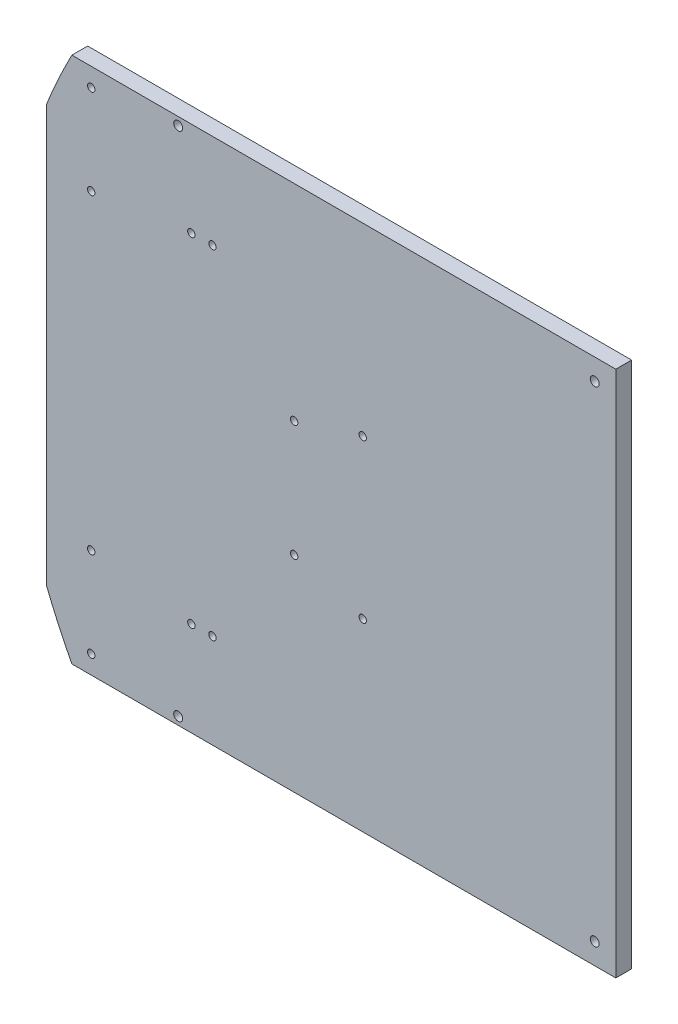
ISO-10303-21;
HEADER;
FILE_DESCRIPTION(('STEP AP214'),'2;1');
FILE_NAME('part.step','',(''),(''),'','','');
FILE_SCHEMA(('AUTOMOTIVE_DESIGN { 1 0 10303 214 1 1 1 1 }'));
ENDSEC;
DATA;
#1=APPLICATION_CONTEXT('core data for automotive mechanical design processes');
#2=APPLICATION_PROTOCOL_DEFINITION('international standard','automotive_design',2000,#1);
#3=PRODUCT_CONTEXT('',#1,'mechanical');
#4=PRODUCT('Part','Part','',(#3));
#5=PRODUCT_RELATED_PRODUCT_CATEGORY('part','',(#4));
#6=PRODUCT_DEFINITION_FORMATION('','',#4);
#7=PRODUCT_DEFINITION_CONTEXT('part definition',#1,'design');
#8=PRODUCT_DEFINITION('design','',#6,#7);
#9=PRODUCT_DEFINITION_SHAPE('','',#8);
#10=(LENGTH_UNIT() NAMED_UNIT(*) SI_UNIT(.MILLI.,.METRE.));
#11=(NAMED_UNIT(*) PLANE_ANGLE_UNIT() SI_UNIT($,.RADIAN.));
#12=(NAMED_UNIT(*) SI_UNIT($,.STERADIAN.) SOLID_ANGLE_UNIT());
#13=UNCERTAINTY_MEASURE_WITH_UNIT(LENGTH_MEASURE(1.E-05),#10,'distance_accuracy_value','');
#14=(GEOMETRIC_REPRESENTATION_CONTEXT(3) GLOBAL_UNCERTAINTY_ASSIGNED_CONTEXT((#13)) GLOBAL_UNIT_ASSIGNED_CONTEXT((#10,
#11,#12)) REPRESENTATION_CONTEXT('',''));
#15=CARTESIAN_POINT('',(0.,0.,0.));
#16=DIRECTION('',(0.,0.,1.));
#17=DIRECTION('',(1.,0.,0.));
#18=AXIS2_PLACEMENT_3D('',#15,#16,#17);
#19=CARTESIAN_POINT('',(8.,92.,239.3));
#20=DIRECTION('',(0.,0.,1.));
#21=DIRECTION('',(1.,0.,0.));
#22=AXIS2_PLACEMENT_3D('',#19,#20,#21);
#23=CYLINDRICAL_SURFACE('',#22,1.7);
#24=DIRECTION('',(0.,0.,1.));
#25=VECTOR('',#24,1.);
#26=CARTESIAN_POINT('',(9.7,92.,239.3));
#27=LINE('',#26,#25);
#28=CARTESIAN_POINT('',(9.7,92.,239.5));
#29=VERTEX_POINT('',#28);
#30=CARTESIAN_POINT('',(9.7,92.,245.5));
#31=VERTEX_POINT('',#30);
#32=EDGE_CURVE('E9',#29,#31,#27,.T.);
#33=ORIENTED_EDGE('',*,*,#32,.F.);
#34=CARTESIAN_POINT('',(8.,92.,239.5));
#35=DIRECTION('',(0.,0.,1.));
#36=DIRECTION('',(1.,0.,0.));
#37=AXIS2_PLACEMENT_3D('',#34,#35,#36);
#38=CIRCLE('',#37,1.7);
#39=EDGE_CURVE('E409',#29,#29,#38,.T.);
#40=ORIENTED_EDGE('',*,*,#39,.F.);
#41=ORIENTED_EDGE('',*,*,#32,.T.);
#42=CARTESIAN_POINT('',(8.,92.,245.5));
#43=DIRECTION('',(0.,0.,1.));
#44=DIRECTION('',(1.,0.,0.));
#45=AXIS2_PLACEMENT_3D('',#42,#43,#44);
#46=CIRCLE('',#45,1.7);
#47=EDGE_CURVE('E456',#31,#31,#46,.T.);
#48=ORIENTED_EDGE('',*,*,#47,.T.);
#49=EDGE_LOOP('',(#33,#40,#41,#48));
#50=FACE_BOUND('',#49,.T.);
#51=ADVANCED_FACE('F14',(#50),#23,.F.);
#52=CARTESIAN_POINT('',(-80.,30.,239.4));
#53=DIRECTION('',(0.,0.,1.));
#54=DIRECTION('',(1.,0.,0.));
#55=AXIS2_PLACEMENT_3D('',#52,#53,#54);
#56=CYLINDRICAL_SURFACE('',#55,1.4);
#57=DIRECTION('',(0.,0.,1.));
#58=VECTOR('',#57,1.);
#59=CARTESIAN_POINT('',(-78.6,30.,239.4));
#60=LINE('',#59,#58);
#61=CARTESIAN_POINT('',(-78.6,30.,239.5));
#62=VERTEX_POINT('',#61);
#63=CARTESIAN_POINT('',(-78.6,30.,245.5));
#64=VERTEX_POINT('',#63);
#65=EDGE_CURVE('E25',#62,#64,#60,.T.);
#66=ORIENTED_EDGE('',*,*,#65,.F.);
#67=CARTESIAN_POINT('',(-80.,30.,239.5));
#68=DIRECTION('',(0.,0.,1.));
#69=DIRECTION('',(1.,0.,0.));
#70=AXIS2_PLACEMENT_3D('',#67,#68,#69);
#71=CIRCLE('',#70,1.4);
#72=EDGE_CURVE('E405',#62,#62,#71,.T.);
#73=ORIENTED_EDGE('',*,*,#72,.F.);
#74=ORIENTED_EDGE('',*,*,#65,.T.);
#75=CARTESIAN_POINT('',(-80.,30.,245.5));
#76=DIRECTION('',(0.,0.,1.));
#77=DIRECTION('',(1.,0.,0.));
#78=AXIS2_PLACEMENT_3D('',#75,#76,#77);
#79=CIRCLE('',#78,1.4);
#80=EDGE_CURVE('E311',#64,#64,#79,.T.);
#81=ORIENTED_EDGE('',*,*,#80,.T.);
#82=EDGE_LOOP('',(#66,#73,#74,#81));
#83=FACE_BOUND('',#82,.T.);
#84=ADVANCED_FACE('F696',(#83),#56,.F.);
#85=CARTESIAN_POINT('',(-150.,97.,239.3));
#86=DIRECTION('',(0.,0.,1.));
#87=DIRECTION('',(1.,0.,0.));
#88=AXIS2_PLACEMENT_3D('',#85,#86,#87);
#89=CYLINDRICAL_SURFACE('',#88,1.7);
#90=DIRECTION('',(0.,0.,1.));
#91=VECTOR('',#90,1.);
#92=CARTESIAN_POINT('',(-148.3,97.,239.3));
#93=LINE('',#92,#91);
#94=CARTESIAN_POINT('',(-148.3,97.,239.5));
#95=VERTEX_POINT('',#94);
#96=CARTESIAN_POINT('',(-148.3,97.,245.5));
#97=VERTEX_POINT('',#96);
#98=EDGE_CURVE('E445',#95,#97,#93,.T.);
#99=ORIENTED_EDGE('',*,*,#98,.F.);
#100=CARTESIAN_POINT('',(-150.,97.,239.5));
#101=DIRECTION('',(0.,0.,1.));
#102=DIRECTION('',(1.,0.,0.));
#103=AXIS2_PLACEMENT_3D('',#100,#101,#102);
#104=CIRCLE('',#103,1.7);
#105=EDGE_CURVE('E410',#95,#95,#104,.T.);
#106=ORIENTED_EDGE('',*,*,#105,.F.);
#107=ORIENTED_EDGE('',*,*,#98,.T.);
#108=CARTESIAN_POINT('',(-150.,97.,245.5));
#109=DIRECTION('',(0.,0.,1.));
#110=DIRECTION('',(1.,0.,0.));
#111=AXIS2_PLACEMENT_3D('',#108,#109,#110);
#112=CIRCLE('',#111,1.7);
#113=EDGE_CURVE('E307',#97,#97,#112,.T.);
#114=ORIENTED_EDGE('',*,*,#113,.T.);
#115=EDGE_LOOP('',(#99,#106,#107,#114));
#116=FACE_BOUND('',#115,.T.);
#117=ADVANCED_FACE('F701',(#116),#89,.F.);
#118=CARTESIAN_POINT('',(-183.,93.,239.4));
#119=DIRECTION('',(0.,0.,1.));
#120=DIRECTION('',(1.,0.,0.));
#121=AXIS2_PLACEMENT_3D('',#118,#119,#120);
#122=CYLINDRICAL_SURFACE('',#121,1.4);
#123=DIRECTION('',(0.,0.,1.));
#124=VECTOR('',#123,1.);
#125=CARTESIAN_POINT('',(-181.6,93.,239.4));
#126=LINE('',#125,#124);
#127=CARTESIAN_POINT('',(-181.6,93.,239.5));
#128=VERTEX_POINT('',#127);
#129=CARTESIAN_POINT('',(-181.6,93.,245.5));
#130=VERTEX_POINT('',#129);
#131=EDGE_CURVE('E442',#128,#130,#126,.T.);
#132=ORIENTED_EDGE('',*,*,#131,.F.);
#133=CARTESIAN_POINT('',(-183.,93.,239.5));
#134=DIRECTION('',(0.,0.,1.));
#135=DIRECTION('',(1.,0.,0.));
#136=AXIS2_PLACEMENT_3D('',#133,#134,#135);
#137=CIRCLE('',#136,1.4);
#138=EDGE_CURVE('E414',#128,#128,#137,.T.);
#139=ORIENTED_EDGE('',*,*,#138,.F.);
#140=ORIENTED_EDGE('',*,*,#131,.T.);
#141=CARTESIAN_POINT('',(-183.,93.,245.5));
#142=DIRECTION('',(0.,0.,1.));
#143=DIRECTION('',(1.,0.,0.));
#144=AXIS2_PLACEMENT_3D('',#141,#142,#143);
#145=CIRCLE('',#144,1.4);
#146=EDGE_CURVE('E283',#130,#130,#145,.T.);
#147=ORIENTED_EDGE('',*,*,#146,.T.);
#148=EDGE_LOOP('',(#132,#139,#140,#147));
#149=FACE_BOUND('',#148,.T.);
#150=ADVANCED_FACE('F830',(#149),#122,.F.);
#151=CARTESIAN_POINT('',(-137.,64.2,239.4));
#152=DIRECTION('',(0.,0.,1.));
#153=DIRECTION('',(1.,0.,0.));
#154=AXIS2_PLACEMENT_3D('',#151,#152,#153);
#155=CYLINDRICAL_SURFACE('',#154,1.4);
#156=DIRECTION('',(0.,0.,1.));
#157=VECTOR('',#156,1.);
#158=CARTESIAN_POINT('',(-135.6,64.2,239.4));
#159=LINE('',#158,#157);
#160=CARTESIAN_POINT('',(-135.6,64.2,239.5));
#161=VERTEX_POINT('',#160);
#162=CARTESIAN_POINT('',(-135.6,64.2,245.5));
#163=VERTEX_POINT('',#162);
#164=EDGE_CURVE('E390',#161,#163,#159,.T.);
#165=ORIENTED_EDGE('',*,*,#164,.F.);
#166=CARTESIAN_POINT('',(-137.,64.2,239.5));
#167=DIRECTION('',(0.,0.,1.));
#168=DIRECTION('',(1.,0.,0.));
#169=AXIS2_PLACEMENT_3D('',#166,#167,#168);
#170=CIRCLE('',#169,1.4);
#171=EDGE_CURVE('E432',#161,#161,#170,.T.);
#172=ORIENTED_EDGE('',*,*,#171,.F.);
#173=ORIENTED_EDGE('',*,*,#164,.T.);
#174=CARTESIAN_POINT('',(-137.,64.2,245.5));
#175=DIRECTION('',(0.,0.,1.));
#176=DIRECTION('',(1.,0.,0.));
#177=AXIS2_PLACEMENT_3D('',#174,#175,#176);
#178=CIRCLE('',#177,1.4);
#179=EDGE_CURVE('E279',#163,#163,#178,.T.);
#180=ORIENTED_EDGE('',*,*,#179,.T.);
#181=EDGE_LOOP('',(#165,#172,#173,#180));
#182=FACE_BOUND('',#181,.T.);
#183=ADVANCED_FACE('F714',(#182),#155,.F.);
#184=CARTESIAN_POINT('',(-145.,64.2,239.4));
#185=DIRECTION('',(0.,0.,1.));
#186=DIRECTION('',(1.,0.,0.));
#187=AXIS2_PLACEMENT_3D('',#184,#185,#186);
#188=CYLINDRICAL_SURFACE('',#187,1.4);
#189=DIRECTION('',(0.,0.,1.));
#190=VECTOR('',#189,1.);
#191=CARTESIAN_POINT('',(-143.6,64.2,239.4));
#192=LINE('',#191,#190);
#193=CARTESIAN_POINT('',(-143.6,64.2,239.5));
#194=VERTEX_POINT('',#193);
#195=CARTESIAN_POINT('',(-143.6,64.2,245.5));
#196=VERTEX_POINT('',#195);
#197=EDGE_CURVE('E387',#194,#196,#192,.T.);
#198=ORIENTED_EDGE('',*,*,#197,.F.);
#199=CARTESIAN_POINT('',(-145.,64.2,239.5));
#200=DIRECTION('',(0.,0.,1.));
#201=DIRECTION('',(1.,0.,0.));
#202=AXIS2_PLACEMENT_3D('',#199,#200,#201);
#203=CIRCLE('',#202,1.4);
#204=EDGE_CURVE('E452',#194,#194,#203,.T.);
#205=ORIENTED_EDGE('',*,*,#204,.F.);
#206=ORIENTED_EDGE('',*,*,#197,.T.);
#207=CARTESIAN_POINT('',(-145.,64.2,245.5));
#208=DIRECTION('',(0.,0.,1.));
#209=DIRECTION('',(1.,0.,0.));
#210=AXIS2_PLACEMENT_3D('',#207,#208,#209);
#211=CIRCLE('',#210,1.4);
#212=EDGE_CURVE('E284',#196,#196,#211,.T.);
#213=ORIENTED_EDGE('',*,*,#212,.T.);
#214=EDGE_LOOP('',(#198,#205,#206,#213));
#215=FACE_BOUND('',#214,.T.);
#216=ADVANCED_FACE('F506',(#215),#188,.F.);
#217=CARTESIAN_POINT('',(-183.,59.,239.4));
#218=DIRECTION('',(0.,0.,1.));
#219=DIRECTION('',(1.,0.,0.));
#220=AXIS2_PLACEMENT_3D('',#217,#218,#219);
#221=CYLINDRICAL_SURFACE('',#220,1.4);
#222=DIRECTION('',(0.,0.,1.));
#223=VECTOR('',#222,1.);
#224=CARTESIAN_POINT('',(-181.6,59.,239.4));
#225=LINE('',#224,#223);
#226=CARTESIAN_POINT('',(-181.6,59.,239.5));
#227=VERTEX_POINT('',#226);
#228=CARTESIAN_POINT('',(-181.6,59.,245.5));
#229=VERTEX_POINT('',#228);
#230=EDGE_CURVE('E391',#227,#229,#225,.T.);
#231=ORIENTED_EDGE('',*,*,#230,.F.);
#232=CARTESIAN_POINT('',(-183.,59.,239.5));
#233=DIRECTION('',(0.,0.,1.));
#234=DIRECTION('',(1.,0.,0.));
#235=AXIS2_PLACEMENT_3D('',#232,#233,#234);
#236=CIRCLE('',#235,1.4);
#237=EDGE_CURVE('E295',#227,#227,#236,.T.);
#238=ORIENTED_EDGE('',*,*,#237,.F.);
#239=ORIENTED_EDGE('',*,*,#230,.T.);
#240=CARTESIAN_POINT('',(-183.,59.,245.5));
#241=DIRECTION('',(0.,0.,1.));
#242=DIRECTION('',(1.,0.,0.));
#243=AXIS2_PLACEMENT_3D('',#240,#241,#242);
#244=CIRCLE('',#243,1.4);
#245=EDGE_CURVE('E437',#229,#229,#244,.T.);
#246=ORIENTED_EDGE('',*,*,#245,.T.);
#247=EDGE_LOOP('',(#231,#238,#239,#246));
#248=FACE_BOUND('',#247,.T.);
#249=ADVANCED_FACE('F713',(#248),#221,.F.);
#250=CARTESIAN_POINT('',(-106.,22.,239.4));
#251=DIRECTION('',(0.,0.,1.));
#252=DIRECTION('',(1.,0.,0.));
#253=AXIS2_PLACEMENT_3D('',#250,#251,#252);
#254=CYLINDRICAL_SURFACE('',#253,1.4);
#255=DIRECTION('',(0.,0.,1.));
#256=VECTOR('',#255,1.);
#257=CARTESIAN_POINT('',(-104.6,22.,239.4));
#258=LINE('',#257,#256);
#259=CARTESIAN_POINT('',(-104.6,22.,239.5));
#260=VERTEX_POINT('',#259);
#261=CARTESIAN_POINT('',(-104.6,22.,245.5));
#262=VERTEX_POINT('',#261);
#263=EDGE_CURVE('E371',#260,#262,#258,.T.);
#264=ORIENTED_EDGE('',*,*,#263,.F.);
#265=CARTESIAN_POINT('',(-106.,22.,239.5));
#266=DIRECTION('',(0.,0.,1.));
#267=DIRECTION('',(1.,0.,0.));
#268=AXIS2_PLACEMENT_3D('',#265,#266,#267);
#269=CIRCLE('',#268,1.4);
#270=EDGE_CURVE('E291',#260,#260,#269,.T.);
#271=ORIENTED_EDGE('',*,*,#270,.F.);
#272=ORIENTED_EDGE('',*,*,#263,.T.);
#273=CARTESIAN_POINT('',(-106.,22.,245.5));
#274=DIRECTION('',(0.,0.,1.));
#275=DIRECTION('',(1.,0.,0.));
#276=AXIS2_PLACEMENT_3D('',#273,#274,#275);
#277=CIRCLE('',#276,1.4);
#278=EDGE_CURVE('E434',#262,#262,#277,.T.);
#279=ORIENTED_EDGE('',*,*,#278,.T.);
#280=EDGE_LOOP('',(#264,#271,#272,#279));
#281=FACE_BOUND('',#280,.T.);
#282=ADVANCED_FACE('F728',(#281),#254,.F.);
#283=CARTESIAN_POINT('',(-80.,-30.,239.4));
#284=DIRECTION('',(0.,0.,1.));
#285=DIRECTION('',(1.,0.,0.));
#286=AXIS2_PLACEMENT_3D('',#283,#284,#285);
#287=CYLINDRICAL_SURFACE('',#286,1.4);
#288=DIRECTION('',(0.,0.,1.));
#289=VECTOR('',#288,1.);
#290=CARTESIAN_POINT('',(-78.6,-30.,239.4));
#291=LINE('',#290,#289);
#292=CARTESIAN_POINT('',(-78.6,-30.,239.5));
#293=VERTEX_POINT('',#292);
#294=CARTESIAN_POINT('',(-78.6,-30.,245.5));
#295=VERTEX_POINT('',#294);
#296=EDGE_CURVE('E368',#293,#295,#291,.T.);
#297=ORIENTED_EDGE('',*,*,#296,.F.);
#298=CARTESIAN_POINT('',(-80.,-30.,239.5));
#299=DIRECTION('',(0.,0.,1.));
#300=DIRECTION('',(1.,0.,0.));
#301=AXIS2_PLACEMENT_3D('',#298,#299,#300);
#302=CIRCLE('',#301,1.4);
#303=EDGE_CURVE('E296',#293,#293,#302,.T.);
#304=ORIENTED_EDGE('',*,*,#303,.F.);
#305=ORIENTED_EDGE('',*,*,#296,.T.);
#306=CARTESIAN_POINT('',(-80.,-30.,245.5));
#307=DIRECTION('',(0.,0.,1.));
#308=DIRECTION('',(1.,0.,0.));
#309=AXIS2_PLACEMENT_3D('',#306,#307,#308);
#310=CIRCLE('',#309,1.4);
#311=EDGE_CURVE('E333',#295,#295,#310,.T.);
#312=ORIENTED_EDGE('',*,*,#311,.T.);
#313=EDGE_LOOP('',(#297,#304,#305,#312));
#314=FACE_BOUND('',#313,.T.);
#315=ADVANCED_FACE('F722',(#314),#287,.F.);
#316=CARTESIAN_POINT('',(8.,-92.,239.3));
#317=DIRECTION('',(0.,0.,1.));
#318=DIRECTION('',(1.,0.,0.));
#319=AXIS2_PLACEMENT_3D('',#316,#317,#318);
#320=CYLINDRICAL_SURFACE('',#319,1.7);
#321=DIRECTION('',(0.,0.,1.));
#322=VECTOR('',#321,1.);
#323=CARTESIAN_POINT('',(9.7,-92.,239.3));
#324=LINE('',#323,#322);
#325=CARTESIAN_POINT('',(9.7,-92.,239.5));
#326=VERTEX_POINT('',#325);
#327=CARTESIAN_POINT('',(9.7,-92.,245.5));
#328=VERTEX_POINT('',#327);
#329=EDGE_CURVE('E372',#326,#328,#324,.T.);
#330=ORIENTED_EDGE('',*,*,#329,.F.);
#331=CARTESIAN_POINT('',(8.,-92.,239.5));
#332=DIRECTION('',(0.,0.,1.));
#333=DIRECTION('',(1.,0.,0.));
#334=AXIS2_PLACEMENT_3D('',#331,#332,#333);
#335=CIRCLE('',#334,1.7);
#336=EDGE_CURVE('E306',#326,#326,#335,.T.);
#337=ORIENTED_EDGE('',*,*,#336,.F.);
#338=ORIENTED_EDGE('',*,*,#329,.T.);
#339=CARTESIAN_POINT('',(8.,-92.,245.5));
#340=DIRECTION('',(0.,0.,1.));
#341=DIRECTION('',(1.,0.,0.));
#342=AXIS2_PLACEMENT_3D('',#339,#340,#341);
#343=CIRCLE('',#342,1.7);
#344=EDGE_CURVE('E329',#328,#328,#343,.T.);
#345=ORIENTED_EDGE('',*,*,#344,.T.);
#346=EDGE_LOOP('',(#330,#337,#338,#345));
#347=FACE_BOUND('',#346,.T.);
#348=ADVANCED_FACE('F727',(#347),#320,.F.);
#349=CARTESIAN_POINT('',(-106.,-22.,239.4));
#350=DIRECTION('',(0.,0.,1.));
#351=DIRECTION('',(1.,0.,0.));
#352=AXIS2_PLACEMENT_3D('',#349,#350,#351);
#353=CYLINDRICAL_SURFACE('',#352,1.4);
#354=DIRECTION('',(0.,0.,1.));
#355=VECTOR('',#354,1.);
#356=CARTESIAN_POINT('',(-104.6,-22.,239.4));
#357=LINE('',#356,#355);
#358=CARTESIAN_POINT('',(-104.6,-22.,239.5));
#359=VERTEX_POINT('',#358);
#360=CARTESIAN_POINT('',(-104.6,-22.,245.5));
#361=VERTEX_POINT('',#360);
#362=EDGE_CURVE('E399',#359,#361,#357,.T.);
#363=ORIENTED_EDGE('',*,*,#362,.F.);
#364=CARTESIAN_POINT('',(-106.,-22.,239.5));
#365=DIRECTION('',(0.,0.,1.));
#366=DIRECTION('',(1.,0.,0.));
#367=AXIS2_PLACEMENT_3D('',#364,#365,#366);
#368=CIRCLE('',#367,1.4);
#369=EDGE_CURVE('E321',#359,#359,#368,.T.);
#370=ORIENTED_EDGE('',*,*,#369,.F.);
#371=ORIENTED_EDGE('',*,*,#362,.T.);
#372=CARTESIAN_POINT('',(-106.,-22.,245.5));
#373=DIRECTION('',(0.,0.,1.));
#374=DIRECTION('',(1.,0.,0.));
#375=AXIS2_PLACEMENT_3D('',#372,#373,#374);
#376=CIRCLE('',#375,1.4);
#377=EDGE_CURVE('E334',#361,#361,#376,.T.);
#378=ORIENTED_EDGE('',*,*,#377,.T.);
#379=EDGE_LOOP('',(#363,#370,#371,#378));
#380=FACE_BOUND('',#379,.T.);
#381=ADVANCED_FACE('F766',(#380),#353,.F.);
#382=CARTESIAN_POINT('',(-137.,-64.2,239.4));
#383=DIRECTION('',(0.,0.,1.));
#384=DIRECTION('',(1.,0.,0.));
#385=AXIS2_PLACEMENT_3D('',#382,#383,#384);
#386=CYLINDRICAL_SURFACE('',#385,1.4);
#387=DIRECTION('',(0.,0.,1.));
#388=VECTOR('',#387,1.);
#389=CARTESIAN_POINT('',(-135.6,-64.2,239.4));
#390=LINE('',#389,#388);
#391=CARTESIAN_POINT('',(-135.6,-64.2,239.5));
#392=VERTEX_POINT('',#391);
#393=CARTESIAN_POINT('',(-135.6,-64.2,245.5));
#394=VERTEX_POINT('',#393);
#395=EDGE_CURVE('E351',#392,#394,#390,.T.);
#396=ORIENTED_EDGE('',*,*,#395,.F.);
#397=CARTESIAN_POINT('',(-137.,-64.2,239.5));
#398=DIRECTION('',(0.,0.,1.));
#399=DIRECTION('',(1.,0.,0.));
#400=AXIS2_PLACEMENT_3D('',#397,#398,#399);
#401=CIRCLE('',#400,1.4);
#402=EDGE_CURVE('E317',#392,#392,#401,.T.);
#403=ORIENTED_EDGE('',*,*,#402,.F.);
#404=ORIENTED_EDGE('',*,*,#395,.T.);
#405=CARTESIAN_POINT('',(-137.,-64.2,245.5));
#406=DIRECTION('',(0.,0.,1.));
#407=DIRECTION('',(1.,0.,0.));
#408=AXIS2_PLACEMENT_3D('',#405,#406,#407);
#409=CIRCLE('',#408,1.4);
#410=EDGE_CURVE('E289',#394,#394,#409,.T.);
#411=ORIENTED_EDGE('',*,*,#410,.T.);
#412=EDGE_LOOP('',(#396,#403,#404,#411));
#413=FACE_BOUND('',#412,.T.);
#414=ADVANCED_FACE('F743',(#413),#386,.F.);
#415=CARTESIAN_POINT('',(-145.,-64.2,239.4));
#416=DIRECTION('',(0.,0.,1.));
#417=DIRECTION('',(1.,0.,0.));
#418=AXIS2_PLACEMENT_3D('',#415,#416,#417);
#419=CYLINDRICAL_SURFACE('',#418,1.4);
#420=DIRECTION('',(0.,0.,1.));
#421=VECTOR('',#420,1.);
#422=CARTESIAN_POINT('',(-143.6,-64.2,239.4));
#423=LINE('',#422,#421);
#424=CARTESIAN_POINT('',(-143.6,-64.2,239.5));
#425=VERTEX_POINT('',#424);
#426=CARTESIAN_POINT('',(-143.6,-64.2,245.5));
#427=VERTEX_POINT('',#426);
#428=EDGE_CURVE('E342',#425,#427,#423,.T.);
#429=ORIENTED_EDGE('',*,*,#428,.F.);
#430=CARTESIAN_POINT('',(-145.,-64.2,239.5));
#431=DIRECTION('',(0.,0.,1.));
#432=DIRECTION('',(1.,0.,0.));
#433=AXIS2_PLACEMENT_3D('',#430,#431,#432);
#434=CIRCLE('',#433,1.4);
#435=EDGE_CURVE('E322',#425,#425,#434,.T.);
#436=ORIENTED_EDGE('',*,*,#435,.F.);
#437=ORIENTED_EDGE('',*,*,#428,.T.);
#438=CARTESIAN_POINT('',(-145.,-64.2,245.5));
#439=DIRECTION('',(0.,0.,1.));
#440=DIRECTION('',(1.,0.,0.));
#441=AXIS2_PLACEMENT_3D('',#438,#439,#440);
#442=CIRCLE('',#441,1.4);
#443=EDGE_CURVE('E285',#427,#427,#442,.T.);
#444=ORIENTED_EDGE('',*,*,#443,.T.);
#445=EDGE_LOOP('',(#429,#436,#437,#444));
#446=FACE_BOUND('',#445,.T.);
#447=ADVANCED_FACE('F737',(#446),#419,.F.);
#448=CARTESIAN_POINT('',(-183.,-59.,239.4));
#449=DIRECTION('',(0.,0.,1.));
#450=DIRECTION('',(1.,0.,0.));
#451=AXIS2_PLACEMENT_3D('',#448,#449,#450);
#452=CYLINDRICAL_SURFACE('',#451,1.4);
#453=DIRECTION('',(0.,0.,1.));
#454=VECTOR('',#453,1.);
#455=CARTESIAN_POINT('',(-181.6,-59.,239.4));
#456=LINE('',#455,#454);
#457=CARTESIAN_POINT('',(-181.6,-59.,239.5));
#458=VERTEX_POINT('',#457);
#459=CARTESIAN_POINT('',(-181.6,-59.,245.5));
#460=VERTEX_POINT('',#459);
#461=EDGE_CURVE('E340',#458,#460,#456,.T.);
#462=ORIENTED_EDGE('',*,*,#461,.F.);
#463=CARTESIAN_POINT('',(-183.,-59.,239.5));
#464=DIRECTION('',(0.,0.,1.));
#465=DIRECTION('',(1.,0.,0.));
#466=AXIS2_PLACEMENT_3D('',#463,#464,#465);
#467=CIRCLE('',#466,1.4);
#468=EDGE_CURVE('E18',#458,#458,#467,.T.);
#469=ORIENTED_EDGE('',*,*,#468,.F.);
#470=ORIENTED_EDGE('',*,*,#461,.T.);
#471=CARTESIAN_POINT('',(-183.,-59.,245.5));
#472=DIRECTION('',(0.,0.,1.));
#473=DIRECTION('',(1.,0.,0.));
#474=AXIS2_PLACEMENT_3D('',#471,#472,#473);
#475=CIRCLE('',#474,1.4);
#476=EDGE_CURVE('E290',#460,#460,#475,.T.);
#477=ORIENTED_EDGE('',*,*,#476,.T.);
#478=EDGE_LOOP('',(#462,#469,#470,#477));
#479=FACE_BOUND('',#478,.T.);
#480=ADVANCED_FACE('F742',(#479),#452,.F.);
#481=CARTESIAN_POINT('',(-150.,-97.,239.3));
#482=DIRECTION('',(0.,0.,1.));
#483=DIRECTION('',(1.,0.,0.));
#484=AXIS2_PLACEMENT_3D('',#481,#482,#483);
#485=CYLINDRICAL_SURFACE('',#484,1.7);
#486=DIRECTION('',(0.,0.,1.));
#487=VECTOR('',#486,1.);
#488=CARTESIAN_POINT('',(-148.3,-97.,239.3));
#489=LINE('',#488,#487);
#490=CARTESIAN_POINT('',(-148.3,-97.,239.5));
#491=VERTEX_POINT('',#490);
#492=CARTESIAN_POINT('',(-148.3,-97.,245.5));
#493=VERTEX_POINT('',#492);
#494=EDGE_CURVE('E343',#491,#493,#489,.T.);
#495=ORIENTED_EDGE('',*,*,#494,.F.);
#496=CARTESIAN_POINT('',(-150.,-97.,239.5));
#497=DIRECTION('',(0.,0.,1.));
#498=DIRECTION('',(1.,0.,0.));
#499=AXIS2_PLACEMENT_3D('',#496,#497,#498);
#500=CIRCLE('',#499,1.7);
#501=EDGE_CURVE('E466',#491,#491,#500,.T.);
#502=ORIENTED_EDGE('',*,*,#501,.F.);
#503=ORIENTED_EDGE('',*,*,#494,.T.);
#504=CARTESIAN_POINT('',(-150.,-97.,245.5));
#505=DIRECTION('',(0.,0.,1.));
#506=DIRECTION('',(1.,0.,0.));
#507=AXIS2_PLACEMENT_3D('',#504,#505,#506);
#508=CIRCLE('',#507,1.7);
#509=EDGE_CURVE('E461',#493,#493,#508,.T.);
#510=ORIENTED_EDGE('',*,*,#509,.T.);
#511=EDGE_LOOP('',(#495,#502,#503,#510));
#512=FACE_BOUND('',#511,.T.);
#513=ADVANCED_FACE('F869',(#512),#485,.F.);
#514=CARTESIAN_POINT('',(-183.,-93.,239.4));
#515=DIRECTION('',(0.,0.,1.));
#516=DIRECTION('',(1.,0.,0.));
#517=AXIS2_PLACEMENT_3D('',#514,#515,#516);
#518=CYLINDRICAL_SURFACE('',#517,1.4);
#519=DIRECTION('',(0.,0.,1.));
#520=VECTOR('',#519,1.);
#521=CARTESIAN_POINT('',(-181.6,-93.,239.4));
#522=LINE('',#521,#520);
#523=CARTESIAN_POINT('',(-181.6,-93.,239.5));
#524=VERTEX_POINT('',#523);
#525=CARTESIAN_POINT('',(-181.6,-93.,245.5));
#526=VERTEX_POINT('',#525);
#527=EDGE_CURVE('E354',#524,#526,#522,.T.);
#528=ORIENTED_EDGE('',*,*,#527,.F.);
#529=CARTESIAN_POINT('',(-183.,-93.,239.5));
#530=DIRECTION('',(0.,0.,1.));
#531=DIRECTION('',(1.,0.,0.));
#532=AXIS2_PLACEMENT_3D('',#529,#530,#531);
#533=CIRCLE('',#532,1.4);
#534=EDGE_CURVE('E338',#524,#524,#533,.T.);
#535=ORIENTED_EDGE('',*,*,#534,.F.);
#536=ORIENTED_EDGE('',*,*,#527,.T.);
#537=CARTESIAN_POINT('',(-183.,-93.,245.5));
#538=DIRECTION('',(0.,0.,1.));
#539=DIRECTION('',(1.,0.,0.));
#540=AXIS2_PLACEMENT_3D('',#537,#538,#539);
#541=CIRCLE('',#540,1.4);
#542=EDGE_CURVE('E475',#526,#526,#541,.T.);
#543=ORIENTED_EDGE('',*,*,#542,.T.);
#544=EDGE_LOOP('',(#528,#535,#536,#543));
#545=FACE_BOUND('',#544,.T.);
#546=ADVANCED_FACE('F663',(#545),#518,.F.);
#547=CARTESIAN_POINT('',(-200.,-78.89810133986,239.5));
#548=DIRECTION('',(0.925459729868298,0.378845995613122,0.));
#549=DIRECTION('',(0.,0.,-1.));
#550=AXIS2_PLACEMENT_3D('',#547,#548,#549);
#551=PLANE('',#550);
#552=DIRECTION('',(0.378845995613122,-0.925459729868298,0.));
#553=VECTOR('',#552,1.);
#554=CARTESIAN_POINT('',(-200.,-78.89810133986,239.5));
#555=LINE('',#554,#553);
#556=CARTESIAN_POINT('',(-200.,-78.89810133986,239.5));
#557=VERTEX_POINT('',#556);
#558=CARTESIAN_POINT('',(-197.9085434922,-84.00719262519,239.5));
#559=VERTEX_POINT('',#558);
#560=EDGE_CURVE('E302',#557,#559,#555,.T.);
#561=ORIENTED_EDGE('',*,*,#560,.T.);
#562=DIRECTION('',(0.,0.,1.));
#563=VECTOR('',#562,1.);
#564=CARTESIAN_POINT('',(-197.9085434922,-84.00719262519,239.5));
#565=LINE('',#564,#563);
#566=CARTESIAN_POINT('',(-197.9085434922,-84.00719262519,245.5));
#567=VERTEX_POINT('',#566);
#568=EDGE_CURVE('E476',#559,#567,#565,.T.);
#569=ORIENTED_EDGE('',*,*,#568,.T.);
#570=DIRECTION('',(0.378845995613122,-0.925459729868298,0.));
#571=VECTOR('',#570,1.);
#572=CARTESIAN_POINT('',(-200.,-78.89810133986,245.5));
#573=LINE('',#572,#571);
#574=CARTESIAN_POINT('',(-200.,-78.89810133986,245.5));
#575=VERTEX_POINT('',#574);
#576=EDGE_CURVE('E274',#575,#567,#573,.T.);
#577=ORIENTED_EDGE('',*,*,#576,.F.);
#578=DIRECTION('',(0.,0.,1.));
#579=VECTOR('',#578,1.);
#580=CARTESIAN_POINT('',(-200.,-78.89810133986,239.5));
#581=LINE('',#580,#579);
#582=EDGE_CURVE('E363',#557,#575,#581,.T.);
#583=ORIENTED_EDGE('',*,*,#582,.F.);
#584=EDGE_LOOP('',(#561,#569,#577,#583));
#585=FACE_BOUND('',#584,.T.);
#586=ADVANCED_FACE('F603',(#585),#551,.F.);
#587=CARTESIAN_POINT('',(-200.,78.898101339862,239.5));
#588=DIRECTION('',(1.,0.,0.));
#589=DIRECTION('',(0.,1.,0.));
#590=AXIS2_PLACEMENT_3D('',#587,#588,#589);
#591=PLANE('',#590);
#592=DIRECTION('',(0.,-1.,0.));
#593=VECTOR('',#592,1.);
#594=CARTESIAN_POINT('',(-200.,78.898101339862,239.5));
#595=LINE('',#594,#593);
#596=CARTESIAN_POINT('',(-200.,78.898101339862,239.5));
#597=VERTEX_POINT('',#596);
#598=EDGE_CURVE('E297',#597,#557,#595,.T.);
#599=ORIENTED_EDGE('',*,*,#598,.T.);
#600=ORIENTED_EDGE('',*,*,#582,.T.);
#601=DIRECTION('',(0.,-1.,0.));
#602=VECTOR('',#601,1.);
#603=CARTESIAN_POINT('',(-200.,78.898101339862,245.5));
#604=LINE('',#603,#602);
#605=CARTESIAN_POINT('',(-200.,78.898101339862,245.5));
#606=VERTEX_POINT('',#605);
#607=EDGE_CURVE('E465',#606,#575,#604,.T.);
#608=ORIENTED_EDGE('',*,*,#607,.F.);
#609=DIRECTION('',(0.,0.,1.));
#610=VECTOR('',#609,1.);
#611=CARTESIAN_POINT('',(-200.,78.898101339862,239.5));
#612=LINE('',#611,#610);
#613=EDGE_CURVE('E427',#597,#606,#612,.T.);
#614=ORIENTED_EDGE('',*,*,#613,.F.);
#615=EDGE_LOOP('',(#599,#600,#608,#614));
#616=FACE_BOUND('',#615,.T.);
#617=ADVANCED_FACE('F607',(#616),#591,.F.);
#618=CARTESIAN_POINT('',(-197.9085434922,-84.00719262519,239.5));
#619=DIRECTION('',(0.915311479119278,0.402746689859122,0.));
#620=DIRECTION('',(0.,0.,-1.));
#621=AXIS2_PLACEMENT_3D('',#618,#619,#620);
#622=PLANE('',#621);
#623=DIRECTION('',(0.402746689859122,-0.915311479119278,0.));
#624=VECTOR('',#623,1.);
#625=CARTESIAN_POINT('',(-197.9085434922,-84.00719262519,239.5));
#626=LINE('',#625,#624);
#627=CARTESIAN_POINT('',(-195.6416732384,-89.15904717109,239.5));
#628=VERTEX_POINT('',#627);
#629=EDGE_CURVE('E316',#559,#628,#626,.T.);
#630=ORIENTED_EDGE('',*,*,#629,.T.);
#631=DIRECTION('',(0.,0.,1.));
#632=VECTOR('',#631,1.);
#633=CARTESIAN_POINT('',(-195.6416732384,-89.15904717109,239.5));
#634=LINE('',#633,#632);
#635=CARTESIAN_POINT('',(-195.6416732384,-89.15904717109,245.5));
#636=VERTEX_POINT('',#635);
#637=EDGE_CURVE('E424',#628,#636,#634,.T.);
#638=ORIENTED_EDGE('',*,*,#637,.T.);
#639=DIRECTION('',(0.402746689859122,-0.915311479119278,0.));
#640=VECTOR('',#639,1.);
#641=CARTESIAN_POINT('',(-197.9085434922,-84.00719262519,245.5));
#642=LINE('',#641,#640);
#643=EDGE_CURVE('E269',#567,#636,#642,.T.);
#644=ORIENTED_EDGE('',*,*,#643,.F.);
#645=ORIENTED_EDGE('',*,*,#568,.F.);
#646=EDGE_LOOP('',(#630,#638,#644,#645));
#647=FACE_BOUND('',#646,.T.);
#648=ADVANCED_FACE('F598',(#647),#622,.F.);
#649=CARTESIAN_POINT('',(-197.9085434922,84.007192625194,239.5));
#650=DIRECTION('',(0.925459729868298,-0.378845995613122,0.));
#651=DIRECTION('',(0.,0.,-1.));
#652=AXIS2_PLACEMENT_3D('',#649,#650,#651);
#653=PLANE('',#652);
#654=DIRECTION('',(-0.378845995613122,-0.925459729868298,0.));
#655=VECTOR('',#654,1.);
#656=CARTESIAN_POINT('',(-197.9085434922,84.007192625194,239.5));
#657=LINE('',#656,#655);
#658=CARTESIAN_POINT('',(-197.9085434922,84.007192625194,239.5));
#659=VERTEX_POINT('',#658);
#660=EDGE_CURVE('E301',#659,#597,#657,.T.);
#661=ORIENTED_EDGE('',*,*,#660,.T.);
#662=ORIENTED_EDGE('',*,*,#613,.T.);
#663=DIRECTION('',(-0.378845995613122,-0.925459729868298,0.));
#664=VECTOR('',#663,1.);
#665=CARTESIAN_POINT('',(-197.9085434922,84.007192625194,245.5));
#666=LINE('',#665,#664);
#667=CARTESIAN_POINT('',(-197.9085434922,84.007192625194,245.5));
#668=VERTEX_POINT('',#667);
#669=EDGE_CURVE('E327',#668,#606,#666,.T.);
#670=ORIENTED_EDGE('',*,*,#669,.F.);
#671=DIRECTION('',(0.,0.,1.));
#672=VECTOR('',#671,1.);
#673=CARTESIAN_POINT('',(-197.9085434922,84.007192625194,239.5));
#674=LINE('',#673,#672);
#675=EDGE_CURVE('E398',#659,#668,#674,.T.);
#676=ORIENTED_EDGE('',*,*,#675,.F.);
#677=EDGE_LOOP('',(#661,#662,#670,#676));
#678=FACE_BOUND('',#677,.T.);
#679=ADVANCED_FACE('F614',(#678),#653,.F.);
#680=CARTESIAN_POINT('',(-195.6416732384,-89.15904717109,239.5));
#681=DIRECTION('',(0.904455145454478,0.426568739901225,0.));
#682=DIRECTION('',(0.,0.,-1.));
#683=AXIS2_PLACEMENT_3D('',#680,#681,#682);
#684=PLANE('',#683);
#685=DIRECTION('',(0.426568739901225,-0.904455145454478,0.));
#686=VECTOR('',#685,1.);
#687=CARTESIAN_POINT('',(-195.6416732384,-89.15904717109,239.5));
#688=LINE('',#687,#686);
#689=CARTESIAN_POINT('',(-193.2407199543,-94.24979655965,239.5));
#690=VERTEX_POINT('',#689);
#691=EDGE_CURVE('E312',#628,#690,#688,.T.);
#692=ORIENTED_EDGE('',*,*,#691,.T.);
#693=DIRECTION('',(0.,0.,1.));
#694=VECTOR('',#693,1.);
#695=CARTESIAN_POINT('',(-193.2407199543,-94.24979655965,239.5));
#696=LINE('',#695,#694);
#697=CARTESIAN_POINT('',(-193.2407199543,-94.24979655965,245.5));
#698=VERTEX_POINT('',#697);
#699=EDGE_CURVE('E376',#690,#698,#696,.T.);
#700=ORIENTED_EDGE('',*,*,#699,.T.);
#701=DIRECTION('',(0.426568739901225,-0.904455145454478,0.));
#702=VECTOR('',#701,1.);
#703=CARTESIAN_POINT('',(-195.6416732384,-89.15904717109,245.5));
#704=LINE('',#703,#702);
#705=EDGE_CURVE('E273',#636,#698,#704,.T.);
#706=ORIENTED_EDGE('',*,*,#705,.F.);
#707=ORIENTED_EDGE('',*,*,#637,.F.);
#708=EDGE_LOOP('',(#692,#700,#706,#707));
#709=FACE_BOUND('',#708,.T.);
#710=ADVANCED_FACE('F594',(#709),#684,.F.);
#711=CARTESIAN_POINT('',(-195.6416732384,89.159047171091,239.5));
#712=DIRECTION('',(0.915311479119278,-0.402746689859122,0.));
#713=DIRECTION('',(0.,0.,-1.));
#714=AXIS2_PLACEMENT_3D('',#711,#712,#713);
#715=PLANE('',#714);
#716=DIRECTION('',(-0.402746689859122,-0.915311479119278,0.));
#717=VECTOR('',#716,1.);
#718=CARTESIAN_POINT('',(-195.6416732384,89.159047171091,239.5));
#719=LINE('',#718,#717);
#720=CARTESIAN_POINT('',(-195.6416732384,89.159047171091,239.5));
#721=VERTEX_POINT('',#720);
#722=EDGE_CURVE('E339',#721,#659,#719,.T.);
#723=ORIENTED_EDGE('',*,*,#722,.T.);
#724=ORIENTED_EDGE('',*,*,#675,.T.);
#725=DIRECTION('',(-0.402746689859122,-0.915311479119278,0.));
#726=VECTOR('',#725,1.);
#727=CARTESIAN_POINT('',(-195.6416732384,89.159047171091,245.5));
#728=LINE('',#727,#726);
#729=CARTESIAN_POINT('',(-195.6416732384,89.159047171091,245.5));
#730=VERTEX_POINT('',#729);
#731=EDGE_CURVE('E323',#730,#668,#728,.T.);
#732=ORIENTED_EDGE('',*,*,#731,.F.);
#733=DIRECTION('',(0.,0.,1.));
#734=VECTOR('',#733,1.);
#735=CARTESIAN_POINT('',(-195.6416732384,89.159047171091,239.5));
#736=LINE('',#735,#734);
#737=EDGE_CURVE('E373',#721,#730,#736,.T.);
#738=ORIENTED_EDGE('',*,*,#737,.F.);
#739=EDGE_LOOP('',(#723,#724,#732,#738));
#740=FACE_BOUND('',#739,.T.);
#741=ADVANCED_FACE('F618',(#740),#715,.F.);
#742=CARTESIAN_POINT('',(-193.2407199543,-94.24979655965,239.5));
#743=DIRECTION('',(0.892105820085702,0.451826521763849,0.));
#744=DIRECTION('',(0.,0.,-1.));
#745=AXIS2_PLACEMENT_3D('',#742,#743,#744);
#746=PLANE('',#745);
#747=DIRECTION('',(0.451826521763849,-0.892105820085702,0.));
#748=VECTOR('',#747,1.);
#749=CARTESIAN_POINT('',(-193.2407199543,-94.24979655965,239.5));
#750=LINE('',#749,#748);
#751=CARTESIAN_POINT('',(-190.3284035436,-100.,239.5));
#752=VERTEX_POINT('',#751);
#753=EDGE_CURVE('E239',#690,#752,#750,.T.);
#754=ORIENTED_EDGE('',*,*,#753,.T.);
#755=DIRECTION('',(0.,0.,1.));
#756=VECTOR('',#755,1.);
#757=CARTESIAN_POINT('',(-190.3284035436,-100.,239.5));
#758=LINE('',#757,#756);
#759=CARTESIAN_POINT('',(-190.3284035436,-100.,245.5));
#760=VERTEX_POINT('',#759);
#761=EDGE_CURVE('E233',#752,#760,#758,.T.);
#762=ORIENTED_EDGE('',*,*,#761,.T.);
#763=DIRECTION('',(0.451826521763849,-0.892105820085702,0.));
#764=VECTOR('',#763,1.);
#765=CARTESIAN_POINT('',(-193.2407199543,-94.24979655965,245.5));
#766=LINE('',#765,#764);
#767=EDGE_CURVE('E275',#698,#760,#766,.T.);
#768=ORIENTED_EDGE('',*,*,#767,.F.);
#769=ORIENTED_EDGE('',*,*,#699,.F.);
#770=EDGE_LOOP('',(#754,#762,#768,#769));
#771=FACE_BOUND('',#770,.T.);
#772=ADVANCED_FACE('F586',(#771),#746,.F.);
#773=CARTESIAN_POINT('',(-193.2407199543,94.249796559652,239.5));
#774=DIRECTION('',(0.904455145454478,-0.426568739901225,0.));
#775=DIRECTION('',(0.,0.,-1.));
#776=AXIS2_PLACEMENT_3D('',#773,#774,#775);
#777=PLANE('',#776);
#778=DIRECTION('',(-0.426568739901225,-0.904455145454478,0.));
#779=VECTOR('',#778,1.);
#780=CARTESIAN_POINT('',(-193.2407199543,94.249796559652,239.5));
#781=LINE('',#780,#779);
#782=CARTESIAN_POINT('',(-193.2407199543,94.249796559652,239.5));
#783=VERTEX_POINT('',#782);
#784=EDGE_CURVE('E335',#783,#721,#781,.T.);
#785=ORIENTED_EDGE('',*,*,#784,.T.);
#786=ORIENTED_EDGE('',*,*,#737,.T.);
#787=DIRECTION('',(-0.426568739901225,-0.904455145454478,0.));
#788=VECTOR('',#787,1.);
#789=CARTESIAN_POINT('',(-193.2407199543,94.249796559652,245.5));
#790=LINE('',#789,#788);
#791=CARTESIAN_POINT('',(-193.2407199543,94.249796559652,245.5));
#792=VERTEX_POINT('',#791);
#793=EDGE_CURVE('E328',#792,#730,#790,.T.);
#794=ORIENTED_EDGE('',*,*,#793,.F.);
#795=DIRECTION('',(0.,0.,1.));
#796=VECTOR('',#795,1.);
#797=CARTESIAN_POINT('',(-193.2407199543,94.249796559652,239.5));
#798=LINE('',#797,#796);
#799=EDGE_CURVE('E377',#783,#792,#798,.T.);
#800=ORIENTED_EDGE('',*,*,#799,.F.);
#801=EDGE_LOOP('',(#785,#786,#794,#800));
#802=FACE_BOUND('',#801,.T.);
#803=ADVANCED_FACE('F552',(#802),#777,.F.);
#804=CARTESIAN_POINT('',(-190.3284035436,-100.,239.5));
#805=DIRECTION('',(0.,1.,0.));
#806=DIRECTION('',(1.,0.,0.));
#807=AXIS2_PLACEMENT_3D('',#804,#805,#806);
#808=PLANE('',#807);
#809=DIRECTION('',(1.,0.,0.));
#810=VECTOR('',#809,1.);
#811=CARTESIAN_POINT('',(-190.3284035436,-100.,239.5));
#812=LINE('',#811,#810);
#813=CARTESIAN_POINT('',(16.,-100.,239.5));
#814=VERTEX_POINT('',#813);
#815=EDGE_CURVE('E228',#752,#814,#812,.T.);
#816=ORIENTED_EDGE('',*,*,#815,.T.);
#817=DIRECTION('',(0.,0.,1.));
#818=VECTOR('',#817,1.);
#819=CARTESIAN_POINT('',(16.,-100.,239.5));
#820=LINE('',#819,#818);
#821=CARTESIAN_POINT('',(16.,-100.,245.5));
#822=VERTEX_POINT('',#821);
#823=EDGE_CURVE('E231',#814,#822,#820,.T.);
#824=ORIENTED_EDGE('',*,*,#823,.T.);
#825=DIRECTION('',(1.,0.,0.));
#826=VECTOR('',#825,1.);
#827=CARTESIAN_POINT('',(-190.3284035436,-100.,245.5));
#828=LINE('',#827,#826);
#829=EDGE_CURVE('E266',#760,#822,#828,.T.);
#830=ORIENTED_EDGE('',*,*,#829,.F.);
#831=ORIENTED_EDGE('',*,*,#761,.F.);
#832=EDGE_LOOP('',(#816,#824,#830,#831));
#833=FACE_BOUND('',#832,.T.);
#834=ADVANCED_FACE('F16',(#833),#808,.F.);
#835=CARTESIAN_POINT('',(-89.85330511268,0.,245.5));
#836=DIRECTION('',(0.,0.,1.));
#837=DIRECTION('',(1.,0.,0.));
#838=AXIS2_PLACEMENT_3D('',#835,#836,#837);
#839=PLANE('',#838);
#840=ORIENTED_EDGE('',*,*,#47,.F.);
#841=EDGE_LOOP('',(#840));
#842=FACE_BOUND('',#841,.T.);
#843=ORIENTED_EDGE('',*,*,#80,.F.);
#844=EDGE_LOOP('',(#843));
#845=FACE_BOUND('',#844,.T.);
#846=ORIENTED_EDGE('',*,*,#113,.F.);
#847=EDGE_LOOP('',(#846));
#848=FACE_BOUND('',#847,.T.);
#849=ORIENTED_EDGE('',*,*,#146,.F.);
#850=EDGE_LOOP('',(#849));
#851=FACE_BOUND('',#850,.T.);
#852=ORIENTED_EDGE('',*,*,#179,.F.);
#853=EDGE_LOOP('',(#852));
#854=FACE_BOUND('',#853,.T.);
#855=ORIENTED_EDGE('',*,*,#212,.F.);
#856=EDGE_LOOP('',(#855));
#857=FACE_BOUND('',#856,.T.);
#858=ORIENTED_EDGE('',*,*,#245,.F.);
#859=EDGE_LOOP('',(#858));
#860=FACE_BOUND('',#859,.T.);
#861=ORIENTED_EDGE('',*,*,#278,.F.);
#862=EDGE_LOOP('',(#861));
#863=FACE_BOUND('',#862,.T.);
#864=ORIENTED_EDGE('',*,*,#311,.F.);
#865=EDGE_LOOP('',(#864));
#866=FACE_BOUND('',#865,.T.);
#867=ORIENTED_EDGE('',*,*,#344,.F.);
#868=EDGE_LOOP('',(#867));
#869=FACE_BOUND('',#868,.T.);
#870=ORIENTED_EDGE('',*,*,#377,.F.);
#871=EDGE_LOOP('',(#870));
#872=FACE_BOUND('',#871,.T.);
#873=ORIENTED_EDGE('',*,*,#410,.F.);
#874=EDGE_LOOP('',(#873));
#875=FACE_BOUND('',#874,.T.);
#876=ORIENTED_EDGE('',*,*,#443,.F.);
#877=EDGE_LOOP('',(#876));
#878=FACE_BOUND('',#877,.T.);
#879=ORIENTED_EDGE('',*,*,#476,.F.);
#880=EDGE_LOOP('',(#879));
#881=FACE_BOUND('',#880,.T.);
#882=ORIENTED_EDGE('',*,*,#509,.F.);
#883=EDGE_LOOP('',(#882));
#884=FACE_BOUND('',#883,.T.);
#885=ORIENTED_EDGE('',*,*,#542,.F.);
#886=EDGE_LOOP('',(#885));
#887=FACE_BOUND('',#886,.T.);
#888=DIRECTION('',(-1.,0.,0.));
#889=VECTOR('',#888,1.);
#890=CARTESIAN_POINT('',(16.,100.,245.5));
#891=LINE('',#890,#889);
#892=CARTESIAN_POINT('',(16.,100.,245.5));
#893=VERTEX_POINT('',#892);
#894=CARTESIAN_POINT('',(-190.3284035436,100.,245.5));
#895=VERTEX_POINT('',#894);
#896=EDGE_CURVE('E263',#893,#895,#891,.T.);
#897=ORIENTED_EDGE('',*,*,#896,.T.);
#898=DIRECTION('',(-0.451826521763849,-0.892105820085702,0.));
#899=VECTOR('',#898,1.);
#900=CARTESIAN_POINT('',(-190.3284035436,100.,245.5));
#901=LINE('',#900,#899);
#902=EDGE_CURVE('E240',#895,#792,#901,.T.);
#903=ORIENTED_EDGE('',*,*,#902,.T.);
#904=ORIENTED_EDGE('',*,*,#793,.T.);
#905=ORIENTED_EDGE('',*,*,#731,.T.);
#906=ORIENTED_EDGE('',*,*,#669,.T.);
#907=ORIENTED_EDGE('',*,*,#607,.T.);
#908=ORIENTED_EDGE('',*,*,#576,.T.);
#909=ORIENTED_EDGE('',*,*,#643,.T.);
#910=ORIENTED_EDGE('',*,*,#705,.T.);
#911=ORIENTED_EDGE('',*,*,#767,.T.);
#912=ORIENTED_EDGE('',*,*,#829,.T.);
#913=DIRECTION('',(0.,1.,0.));
#914=VECTOR('',#913,1.);
#915=CARTESIAN_POINT('',(16.,-100.,245.5));
#916=LINE('',#915,#914);
#917=EDGE_CURVE('E247',#822,#893,#916,.T.);
#918=ORIENTED_EDGE('',*,*,#917,.T.);
#919=EDGE_LOOP('',(#897,#903,#904,#905,#906,#907,#908,#909,#910,#911,#912,#918));
#920=FACE_BOUND('',#919,.T.);
#921=ADVANCED_FACE('F510',(#842,#845,#848,#851,#854,#857,#860,#863,#866,#869,#872,#875,#878,
#881,#884,#887,#920),#839,.T.);
#922=CARTESIAN_POINT('',(-89.85330511268,0.,239.5));
#923=DIRECTION('',(0.,0.,1.));
#924=DIRECTION('',(1.,0.,0.));
#925=AXIS2_PLACEMENT_3D('',#922,#923,#924);
#926=PLANE('',#925);
#927=ORIENTED_EDGE('',*,*,#39,.T.);
#928=EDGE_LOOP('',(#927));
#929=FACE_BOUND('',#928,.T.);
#930=ORIENTED_EDGE('',*,*,#72,.T.);
#931=EDGE_LOOP('',(#930));
#932=FACE_BOUND('',#931,.T.);
#933=ORIENTED_EDGE('',*,*,#105,.T.);
#934=EDGE_LOOP('',(#933));
#935=FACE_BOUND('',#934,.T.);
#936=ORIENTED_EDGE('',*,*,#138,.T.);
#937=EDGE_LOOP('',(#936));
#938=FACE_BOUND('',#937,.T.);
#939=ORIENTED_EDGE('',*,*,#171,.T.);
#940=EDGE_LOOP('',(#939));
#941=FACE_BOUND('',#940,.T.);
#942=ORIENTED_EDGE('',*,*,#204,.T.);
#943=EDGE_LOOP('',(#942));
#944=FACE_BOUND('',#943,.T.);
#945=ORIENTED_EDGE('',*,*,#237,.T.);
#946=EDGE_LOOP('',(#945));
#947=FACE_BOUND('',#946,.T.);
#948=ORIENTED_EDGE('',*,*,#270,.T.);
#949=EDGE_LOOP('',(#948));
#950=FACE_BOUND('',#949,.T.);
#951=ORIENTED_EDGE('',*,*,#303,.T.);
#952=EDGE_LOOP('',(#951));
#953=FACE_BOUND('',#952,.T.);
#954=ORIENTED_EDGE('',*,*,#336,.T.);
#955=EDGE_LOOP('',(#954));
#956=FACE_BOUND('',#955,.T.);
#957=ORIENTED_EDGE('',*,*,#369,.T.);
#958=EDGE_LOOP('',(#957));
#959=FACE_BOUND('',#958,.T.);
#960=ORIENTED_EDGE('',*,*,#402,.T.);
#961=EDGE_LOOP('',(#960));
#962=FACE_BOUND('',#961,.T.);
#963=ORIENTED_EDGE('',*,*,#435,.T.);
#964=EDGE_LOOP('',(#963));
#965=FACE_BOUND('',#964,.T.);
#966=ORIENTED_EDGE('',*,*,#468,.T.);
#967=EDGE_LOOP('',(#966));
#968=FACE_BOUND('',#967,.T.);
#969=ORIENTED_EDGE('',*,*,#501,.T.);
#970=EDGE_LOOP('',(#969));
#971=FACE_BOUND('',#970,.T.);
#972=ORIENTED_EDGE('',*,*,#534,.T.);
#973=EDGE_LOOP('',(#972));
#974=FACE_BOUND('',#973,.T.);
#975=DIRECTION('',(0.,1.,0.));
#976=VECTOR('',#975,1.);
#977=CARTESIAN_POINT('',(16.,-100.,239.5));
#978=LINE('',#977,#976);
#979=CARTESIAN_POINT('',(16.,100.,239.5));
#980=VERTEX_POINT('',#979);
#981=EDGE_CURVE('E245',#814,#980,#978,.T.);
#982=ORIENTED_EDGE('',*,*,#981,.F.);
#983=ORIENTED_EDGE('',*,*,#815,.F.);
#984=ORIENTED_EDGE('',*,*,#753,.F.);
#985=ORIENTED_EDGE('',*,*,#691,.F.);
#986=ORIENTED_EDGE('',*,*,#629,.F.);
#987=ORIENTED_EDGE('',*,*,#560,.F.);
#988=ORIENTED_EDGE('',*,*,#598,.F.);
#989=ORIENTED_EDGE('',*,*,#660,.F.);
#990=ORIENTED_EDGE('',*,*,#722,.F.);
#991=ORIENTED_EDGE('',*,*,#784,.F.);
#992=DIRECTION('',(-0.451826521763849,-0.892105820085702,0.));
#993=VECTOR('',#992,1.);
#994=CARTESIAN_POINT('',(-190.3284035436,100.,239.5));
#995=LINE('',#994,#993);
#996=CARTESIAN_POINT('',(-190.3284035436,100.,239.5));
#997=VERTEX_POINT('',#996);
#998=EDGE_CURVE('E249',#997,#783,#995,.T.);
#999=ORIENTED_EDGE('',*,*,#998,.F.);
#1000=DIRECTION('',(-1.,0.,0.));
#1001=VECTOR('',#1000,1.);
#1002=CARTESIAN_POINT('',(16.,100.,239.5));
#1003=LINE('',#1002,#1001);
#1004=EDGE_CURVE('E254',#980,#997,#1003,.T.);
#1005=ORIENTED_EDGE('',*,*,#1004,.F.);
#1006=EDGE_LOOP('',(#982,#983,#984,#985,#986,#987,#988,#989,#990,#991,#999,#1005));
#1007=FACE_BOUND('',#1006,.T.);
#1008=ADVANCED_FACE('F252',(#929,#932,#935,#938,#941,#944,#947,#950,#953,#956,#959,#962,#965,
#968,#971,#974,#1007),#926,.F.);
#1009=CARTESIAN_POINT('',(-190.3284035436,100.,239.5));
#1010=DIRECTION('',(0.892105820085702,-0.451826521763849,0.));
#1011=DIRECTION('',(0.,0.,-1.));
#1012=AXIS2_PLACEMENT_3D('',#1009,#1010,#1011);
#1013=PLANE('',#1012);
#1014=ORIENTED_EDGE('',*,*,#998,.T.);
#1015=ORIENTED_EDGE('',*,*,#799,.T.);
#1016=ORIENTED_EDGE('',*,*,#902,.F.);
#1017=DIRECTION('',(0.,0.,1.));
#1018=VECTOR('',#1017,1.);
#1019=CARTESIAN_POINT('',(-190.3284035436,100.,239.5));
#1020=LINE('',#1019,#1018);
#1021=EDGE_CURVE('E395',#997,#895,#1020,.T.);
#1022=ORIENTED_EDGE('',*,*,#1021,.F.);
#1023=EDGE_LOOP('',(#1014,#1015,#1016,#1022));
#1024=FACE_BOUND('',#1023,.T.);
#1025=ADVANCED_FACE('F546',(#1024),#1013,.F.);
#1026=CARTESIAN_POINT('',(16.,-100.,239.5));
#1027=DIRECTION('',(-1.,0.,0.));
#1028=DIRECTION('',(0.,0.,1.));
#1029=AXIS2_PLACEMENT_3D('',#1026,#1027,#1028);
#1030=PLANE('',#1029);
#1031=ORIENTED_EDGE('',*,*,#981,.T.);
#1032=DIRECTION('',(0.,0.,1.));
#1033=VECTOR('',#1032,1.);
#1034=CARTESIAN_POINT('',(16.,100.,239.5));
#1035=LINE('',#1034,#1033);
#1036=EDGE_CURVE('E256',#980,#893,#1035,.T.);
#1037=ORIENTED_EDGE('',*,*,#1036,.T.);
#1038=ORIENTED_EDGE('',*,*,#917,.F.);
#1039=ORIENTED_EDGE('',*,*,#823,.F.);
#1040=EDGE_LOOP('',(#1031,#1037,#1038,#1039));
#1041=FACE_BOUND('',#1040,.T.);
#1042=ADVANCED_FACE('F243',(#1041),#1030,.F.);
#1043=CARTESIAN_POINT('',(16.,100.,239.5));
#1044=DIRECTION('',(0.,-1.,0.));
#1045=DIRECTION('',(0.,0.,-1.));
#1046=AXIS2_PLACEMENT_3D('',#1043,#1044,#1045);
#1047=PLANE('',#1046);
#1048=ORIENTED_EDGE('',*,*,#1004,.T.);
#1049=ORIENTED_EDGE('',*,*,#1021,.T.);
#1050=ORIENTED_EDGE('',*,*,#896,.F.);
#1051=ORIENTED_EDGE('',*,*,#1036,.F.);
#1052=EDGE_LOOP('',(#1048,#1049,#1050,#1051));
#1053=FACE_BOUND('',#1052,.T.);
#1054=ADVANCED_FACE('F543',(#1053),#1047,.F.);
#1055=CLOSED_SHELL('',(#51,#84,#117,#150,#183,#216,#249,#282,#315,#348,#381,#414,#447,#480,#513,
#546,#586,#617,#648,#679,#710,#741,#772,#803,#834,#921,#1008,#1025,#1042,#1054));
#1056=MANIFOLD_SOLID_BREP('B1',#1055);
#1057=ADVANCED_BREP_SHAPE_REPRESENTATION('',(#18,#1056),#14);
#1058=SHAPE_DEFINITION_REPRESENTATION(#9,#1057);
ENDSEC;
END-ISO-10303-21;
